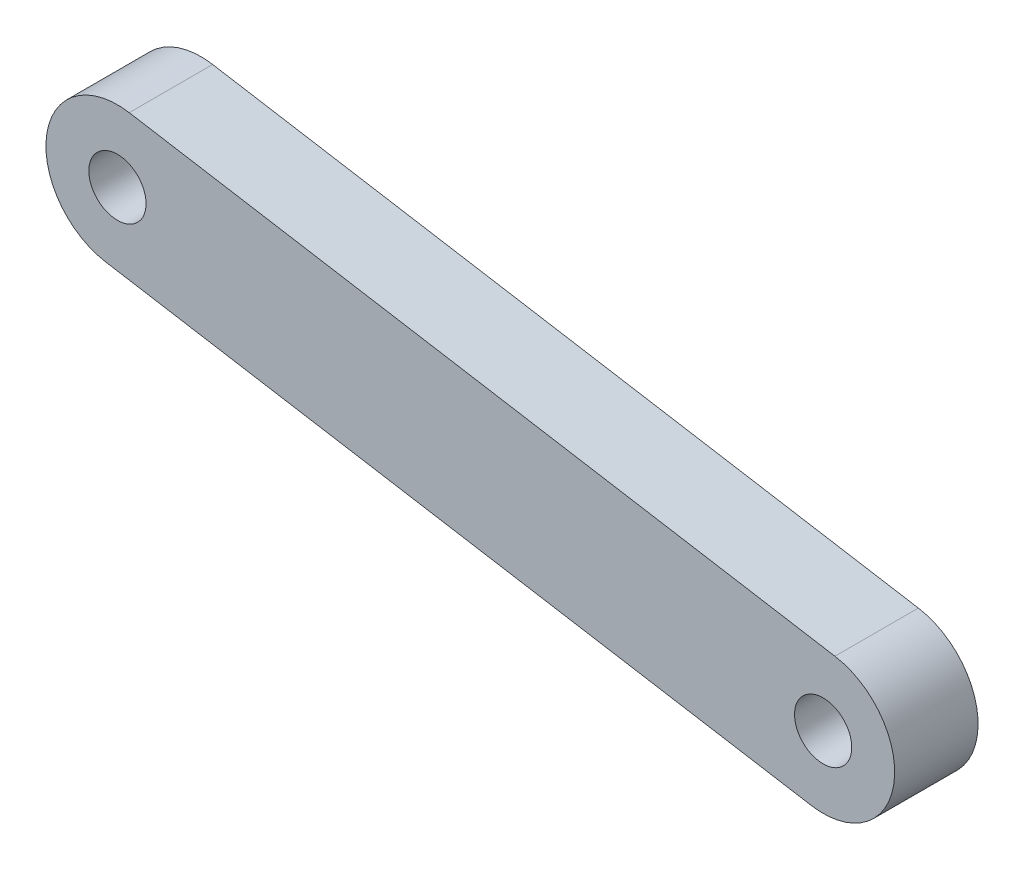
ISO-10303-21;
HEADER;
FILE_DESCRIPTION(('STEP AP214'),'2;1');
FILE_NAME('part.step','',(''),(''),'','','');
FILE_SCHEMA(('AUTOMOTIVE_DESIGN { 1 0 10303 214 1 1 1 1 }'));
ENDSEC;
DATA;
#1=APPLICATION_CONTEXT('core data for automotive mechanical design processes');
#2=APPLICATION_PROTOCOL_DEFINITION('international standard','automotive_design',2000,#1);
#3=PRODUCT_CONTEXT('',#1,'mechanical');
#4=PRODUCT('Part','Part','',(#3));
#5=PRODUCT_RELATED_PRODUCT_CATEGORY('part','',(#4));
#6=PRODUCT_DEFINITION_FORMATION('','',#4);
#7=PRODUCT_DEFINITION_CONTEXT('part definition',#1,'design');
#8=PRODUCT_DEFINITION('design','',#6,#7);
#9=PRODUCT_DEFINITION_SHAPE('','',#8);
#10=(LENGTH_UNIT() NAMED_UNIT(*) SI_UNIT(.MILLI.,.METRE.));
#11=(NAMED_UNIT(*) PLANE_ANGLE_UNIT() SI_UNIT($,.RADIAN.));
#12=(NAMED_UNIT(*) SI_UNIT($,.STERADIAN.) SOLID_ANGLE_UNIT());
#13=UNCERTAINTY_MEASURE_WITH_UNIT(LENGTH_MEASURE(1.E-05),#10,'distance_accuracy_value','');
#14=(GEOMETRIC_REPRESENTATION_CONTEXT(3) GLOBAL_UNCERTAINTY_ASSIGNED_CONTEXT((#13)) GLOBAL_UNIT_ASSIGNED_CONTEXT((#10,
#11,#12)) REPRESENTATION_CONTEXT('',''));
#15=CARTESIAN_POINT('',(0.,0.,0.));
#16=DIRECTION('',(0.,0.,1.));
#17=DIRECTION('',(1.,0.,0.));
#18=AXIS2_PLACEMENT_3D('',#15,#16,#17);
#19=CARTESIAN_POINT('',(1669.20621767917,-949.276093110886,350.));
#20=DIRECTION('',(0.,0.,1.));
#21=DIRECTION('',(1.,0.,0.));
#22=AXIS2_PLACEMENT_3D('',#19,#20,#21);
#23=PLANE('',#22);
#24=CARTESIAN_POINT('',(4629.60152706355,-1443.92442328646,350.));
#25=DIRECTION('',(0.,0.,1.));
#26=DIRECTION('',(1.,0.,0.));
#27=AXIS2_PLACEMENT_3D('',#24,#25,#26);
#28=CIRCLE('',#27,119.999999999981);
#29=CARTESIAN_POINT('',(4749.60152706353,-1443.92442328646,350.));
#30=VERTEX_POINT('',#29);
#31=EDGE_CURVE('E107',#30,#30,#28,.T.);
#32=ORIENTED_EDGE('',*,*,#31,.F.);
#33=EDGE_LOOP('',(#32));
#34=FACE_BOUND('',#33,.T.);
#35=CARTESIAN_POINT('',(1669.20621767917,-949.276093110886,350.));
#36=DIRECTION('',(0.,0.,1.));
#37=DIRECTION('',(1.,0.,0.));
#38=AXIS2_PLACEMENT_3D('',#35,#36,#37);
#39=CIRCLE('',#38,300.);
#40=CARTESIAN_POINT('',(1718.64738678913,-653.378187073956,350.));
#41=VERTEX_POINT('',#40);
#42=CARTESIAN_POINT('',(1619.7650485692,-1245.17399914782,350.));
#43=VERTEX_POINT('',#42);
#44=EDGE_CURVE('E92',#41,#43,#39,.T.);
#45=ORIENTED_EDGE('',*,*,#44,.T.);
#46=DIRECTION('',(0.986326353456434,-0.164803897033213,0.));
#47=VECTOR('',#46,1.);
#48=CARTESIAN_POINT('',(1619.7650485692,-1245.17399914782,350.));
#49=LINE('',#48,#47);
#50=CARTESIAN_POINT('',(4580.16035795359,-1739.82232932339,350.));
#51=VERTEX_POINT('',#50);
#52=EDGE_CURVE('E87',#43,#51,#49,.T.);
#53=ORIENTED_EDGE('',*,*,#52,.T.);
#54=CARTESIAN_POINT('',(4629.60152706355,-1443.92442328646,350.));
#55=DIRECTION('',(0.,0.,1.));
#56=DIRECTION('',(1.,0.,0.));
#57=AXIS2_PLACEMENT_3D('',#54,#55,#56);
#58=CIRCLE('',#57,300.);
#59=CARTESIAN_POINT('',(4679.04269617351,-1148.02651724953,350.));
#60=VERTEX_POINT('',#59);
#61=EDGE_CURVE('E90',#51,#60,#58,.T.);
#62=ORIENTED_EDGE('',*,*,#61,.T.);
#63=DIRECTION('',(-0.986326353456434,0.164803897033213,0.));
#64=VECTOR('',#63,1.);
#65=CARTESIAN_POINT('',(1718.64738678913,-653.378187073956,350.));
#66=LINE('',#65,#64);
#67=EDGE_CURVE('E57',#60,#41,#66,.T.);
#68=ORIENTED_EDGE('',*,*,#67,.T.);
#69=EDGE_LOOP('',(#45,#53,#62,#68));
#70=FACE_BOUND('',#69,.T.);
#71=CARTESIAN_POINT('',(1669.20621767917,-949.276093110886,350.));
#72=DIRECTION('',(0.,0.,1.));
#73=DIRECTION('',(1.,0.,0.));
#74=AXIS2_PLACEMENT_3D('',#71,#72,#73);
#75=CIRCLE('',#74,120.);
#76=CARTESIAN_POINT('',(1789.20621767917,-949.276093110886,350.));
#77=VERTEX_POINT('',#76);
#78=EDGE_CURVE('E122',#77,#77,#75,.T.);
#79=ORIENTED_EDGE('',*,*,#78,.F.);
#80=EDGE_LOOP('',(#79));
#81=FACE_BOUND('',#80,.T.);
#82=ADVANCED_FACE('F40',(#34,#70,#81),#23,.T.);
#83=CARTESIAN_POINT('',(1669.20621767917,-949.276093110886,0.));
#84=DIRECTION('',(0.,0.,1.));
#85=DIRECTION('',(1.,0.,0.));
#86=AXIS2_PLACEMENT_3D('',#83,#84,#85);
#87=PLANE('',#86);
#88=CARTESIAN_POINT('',(1669.20621767917,-949.276093110886,0.));
#89=DIRECTION('',(0.,0.,1.));
#90=DIRECTION('',(1.,0.,0.));
#91=AXIS2_PLACEMENT_3D('',#88,#89,#90);
#92=CIRCLE('',#91,300.);
#93=CARTESIAN_POINT('',(1718.64738678913,-653.378187073956,0.));
#94=VERTEX_POINT('',#93);
#95=CARTESIAN_POINT('',(1619.7650485692,-1245.17399914782,0.));
#96=VERTEX_POINT('',#95);
#97=EDGE_CURVE('E104',#94,#96,#92,.T.);
#98=ORIENTED_EDGE('',*,*,#97,.F.);
#99=DIRECTION('',(-0.986326353456434,0.164803897033213,0.));
#100=VECTOR('',#99,1.);
#101=CARTESIAN_POINT('',(1718.64738678913,-653.378187073956,0.));
#102=LINE('',#101,#100);
#103=CARTESIAN_POINT('',(4679.04269617351,-1148.02651724953,0.));
#104=VERTEX_POINT('',#103);
#105=EDGE_CURVE('E80',#104,#94,#102,.T.);
#106=ORIENTED_EDGE('',*,*,#105,.F.);
#107=CARTESIAN_POINT('',(4629.60152706355,-1443.92442328646,0.));
#108=DIRECTION('',(0.,0.,1.));
#109=DIRECTION('',(1.,0.,0.));
#110=AXIS2_PLACEMENT_3D('',#107,#108,#109);
#111=CIRCLE('',#110,300.);
#112=CARTESIAN_POINT('',(4580.16035795359,-1739.82232932339,0.));
#113=VERTEX_POINT('',#112);
#114=EDGE_CURVE('E74',#113,#104,#111,.T.);
#115=ORIENTED_EDGE('',*,*,#114,.F.);
#116=DIRECTION('',(0.986326353456434,-0.164803897033213,0.));
#117=VECTOR('',#116,1.);
#118=CARTESIAN_POINT('',(1619.7650485692,-1245.17399914782,0.));
#119=LINE('',#118,#117);
#120=EDGE_CURVE('E96',#96,#113,#119,.T.);
#121=ORIENTED_EDGE('',*,*,#120,.F.);
#122=EDGE_LOOP('',(#98,#106,#115,#121));
#123=FACE_BOUND('',#122,.T.);
#124=CARTESIAN_POINT('',(4629.60152706355,-1443.92442328646,0.));
#125=DIRECTION('',(0.,0.,1.));
#126=DIRECTION('',(1.,0.,0.));
#127=AXIS2_PLACEMENT_3D('',#124,#125,#126);
#128=CIRCLE('',#127,119.999999999981);
#129=CARTESIAN_POINT('',(4749.60152706353,-1443.92442328646,0.));
#130=VERTEX_POINT('',#129);
#131=EDGE_CURVE('E119',#130,#130,#128,.T.);
#132=ORIENTED_EDGE('',*,*,#131,.T.);
#133=EDGE_LOOP('',(#132));
#134=FACE_BOUND('',#133,.T.);
#135=CARTESIAN_POINT('',(1669.20621767917,-949.276093110886,0.));
#136=DIRECTION('',(0.,0.,1.));
#137=DIRECTION('',(1.,0.,0.));
#138=AXIS2_PLACEMENT_3D('',#135,#136,#137);
#139=CIRCLE('',#138,120.);
#140=CARTESIAN_POINT('',(1789.20621767917,-949.276093110886,0.));
#141=VERTEX_POINT('',#140);
#142=EDGE_CURVE('E125',#141,#141,#139,.T.);
#143=ORIENTED_EDGE('',*,*,#142,.T.);
#144=EDGE_LOOP('',(#143));
#145=FACE_BOUND('',#144,.T.);
#146=ADVANCED_FACE('F115',(#123,#134,#145),#87,.F.);
#147=CARTESIAN_POINT('',(1669.20621767917,-949.276093110886,350.));
#148=DIRECTION('',(0.,0.,-1.));
#149=DIRECTION('',(-1.,0.,0.));
#150=AXIS2_PLACEMENT_3D('',#147,#148,#149);
#151=CYLINDRICAL_SURFACE('',#150,300.);
#152=ORIENTED_EDGE('',*,*,#97,.T.);
#153=DIRECTION('',(0.,0.,-1.));
#154=VECTOR('',#153,1.);
#155=CARTESIAN_POINT('',(1619.7650485692,-1245.17399914782,350.));
#156=LINE('',#155,#154);
#157=EDGE_CURVE('E11',#43,#96,#156,.T.);
#158=ORIENTED_EDGE('',*,*,#157,.F.);
#159=ORIENTED_EDGE('',*,*,#44,.F.);
#160=DIRECTION('',(0.,0.,-1.));
#161=VECTOR('',#160,1.);
#162=CARTESIAN_POINT('',(1718.64738678913,-653.378187073956,350.));
#163=LINE('',#162,#161);
#164=EDGE_CURVE('E100',#41,#94,#163,.T.);
#165=ORIENTED_EDGE('',*,*,#164,.T.);
#166=EDGE_LOOP('',(#152,#158,#159,#165));
#167=FACE_BOUND('',#166,.T.);
#168=ADVANCED_FACE('F42',(#167),#151,.T.);
#169=CARTESIAN_POINT('',(1619.7650485692,-1245.17399914782,350.));
#170=DIRECTION('',(0.164803897033213,0.986326353456434,0.));
#171=DIRECTION('',(-0.986326353456434,0.164803897033213,0.));
#172=AXIS2_PLACEMENT_3D('',#169,#170,#171);
#173=PLANE('',#172);
#174=ORIENTED_EDGE('',*,*,#120,.T.);
#175=DIRECTION('',(0.,0.,-1.));
#176=VECTOR('',#175,1.);
#177=CARTESIAN_POINT('',(4580.16035795359,-1739.82232932339,350.));
#178=LINE('',#177,#176);
#179=EDGE_CURVE('E49',#51,#113,#178,.T.);
#180=ORIENTED_EDGE('',*,*,#179,.F.);
#181=ORIENTED_EDGE('',*,*,#52,.F.);
#182=ORIENTED_EDGE('',*,*,#157,.T.);
#183=EDGE_LOOP('',(#174,#180,#181,#182));
#184=FACE_BOUND('',#183,.T.);
#185=ADVANCED_FACE('F95',(#184),#173,.F.);
#186=CARTESIAN_POINT('',(4629.60152706355,-1443.92442328646,350.));
#187=DIRECTION('',(0.,0.,-1.));
#188=DIRECTION('',(-1.,0.,0.));
#189=AXIS2_PLACEMENT_3D('',#186,#187,#188);
#190=CYLINDRICAL_SURFACE('',#189,300.);
#191=ORIENTED_EDGE('',*,*,#114,.T.);
#192=DIRECTION('',(0.,0.,-1.));
#193=VECTOR('',#192,1.);
#194=CARTESIAN_POINT('',(4679.04269617351,-1148.02651724953,350.));
#195=LINE('',#194,#193);
#196=EDGE_CURVE('E97',#60,#104,#195,.T.);
#197=ORIENTED_EDGE('',*,*,#196,.F.);
#198=ORIENTED_EDGE('',*,*,#61,.F.);
#199=ORIENTED_EDGE('',*,*,#179,.T.);
#200=EDGE_LOOP('',(#191,#197,#198,#199));
#201=FACE_BOUND('',#200,.T.);
#202=ADVANCED_FACE('F98',(#201),#190,.T.);
#203=CARTESIAN_POINT('',(1718.64738678913,-653.378187073956,350.));
#204=DIRECTION('',(-0.164803897033213,-0.986326353456434,0.));
#205=DIRECTION('',(0.986326353456434,-0.164803897033213,0.));
#206=AXIS2_PLACEMENT_3D('',#203,#204,#205);
#207=PLANE('',#206);
#208=ORIENTED_EDGE('',*,*,#105,.T.);
#209=ORIENTED_EDGE('',*,*,#164,.F.);
#210=ORIENTED_EDGE('',*,*,#67,.F.);
#211=ORIENTED_EDGE('',*,*,#196,.T.);
#212=EDGE_LOOP('',(#208,#209,#210,#211));
#213=FACE_BOUND('',#212,.T.);
#214=ADVANCED_FACE('F112',(#213),#207,.F.);
#215=CARTESIAN_POINT('',(4629.60152706355,-1443.92442328646,350.));
#216=DIRECTION('',(0.,0.,-1.));
#217=DIRECTION('',(-1.,0.,0.));
#218=AXIS2_PLACEMENT_3D('',#215,#216,#217);
#219=CYLINDRICAL_SURFACE('',#218,119.999999999981);
#220=ORIENTED_EDGE('',*,*,#31,.T.);
#221=EDGE_LOOP('',(#220));
#222=FACE_BOUND('',#221,.T.);
#223=ORIENTED_EDGE('',*,*,#131,.F.);
#224=EDGE_LOOP('',(#223));
#225=FACE_BOUND('',#224,.T.);
#226=ADVANCED_FACE('F142',(#222,#225),#219,.F.);
#227=CARTESIAN_POINT('',(1669.20621767917,-949.276093110886,350.));
#228=DIRECTION('',(0.,0.,-1.));
#229=DIRECTION('',(-1.,0.,0.));
#230=AXIS2_PLACEMENT_3D('',#227,#228,#229);
#231=CYLINDRICAL_SURFACE('',#230,120.);
#232=ORIENTED_EDGE('',*,*,#78,.T.);
#233=EDGE_LOOP('',(#232));
#234=FACE_BOUND('',#233,.T.);
#235=ORIENTED_EDGE('',*,*,#142,.F.);
#236=EDGE_LOOP('',(#235));
#237=FACE_BOUND('',#236,.T.);
#238=ADVANCED_FACE('F131',(#234,#237),#231,.F.);
#239=CLOSED_SHELL('',(#82,#146,#168,#185,#202,#214,#226,#238));
#240=MANIFOLD_SOLID_BREP('B2',#239);
#241=ADVANCED_BREP_SHAPE_REPRESENTATION('',(#18,#240),#14);
#242=SHAPE_DEFINITION_REPRESENTATION(#9,#241);
ENDSEC;
END-ISO-10303-21;
